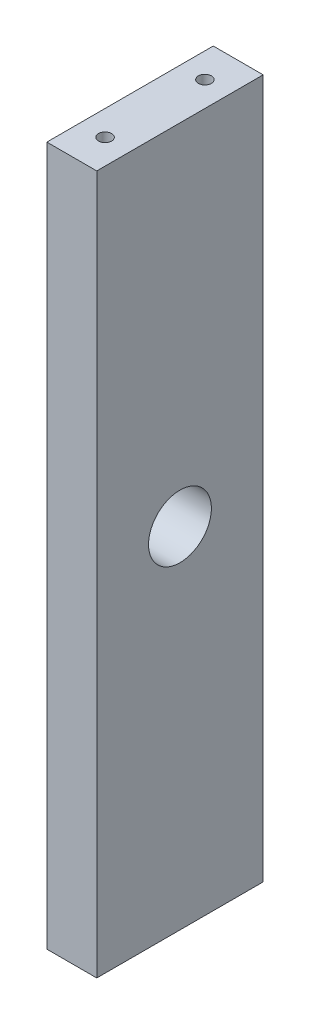
ISO-10303-21;
HEADER;
FILE_DESCRIPTION(('STEP AP214'),'2;1');
FILE_NAME('part.step','',(''),(''),'','','');
FILE_SCHEMA(('AUTOMOTIVE_DESIGN { 1 0 10303 214 1 1 1 1 }'));
ENDSEC;
DATA;
#1=APPLICATION_CONTEXT('core data for automotive mechanical design processes');
#2=APPLICATION_PROTOCOL_DEFINITION('international standard','automotive_design',2000,#1);
#3=PRODUCT_CONTEXT('',#1,'mechanical');
#4=PRODUCT('Part','Part','',(#3));
#5=PRODUCT_RELATED_PRODUCT_CATEGORY('part','',(#4));
#6=PRODUCT_DEFINITION_FORMATION('','',#4);
#7=PRODUCT_DEFINITION_CONTEXT('part definition',#1,'design');
#8=PRODUCT_DEFINITION('design','',#6,#7);
#9=PRODUCT_DEFINITION_SHAPE('','',#8);
#10=(LENGTH_UNIT() NAMED_UNIT(*) SI_UNIT(.MILLI.,.METRE.));
#11=(NAMED_UNIT(*) PLANE_ANGLE_UNIT() SI_UNIT($,.RADIAN.));
#12=(NAMED_UNIT(*) SI_UNIT($,.STERADIAN.) SOLID_ANGLE_UNIT());
#13=UNCERTAINTY_MEASURE_WITH_UNIT(LENGTH_MEASURE(1.E-05),#10,'distance_accuracy_value','');
#14=(GEOMETRIC_REPRESENTATION_CONTEXT(3) GLOBAL_UNCERTAINTY_ASSIGNED_CONTEXT((#13)) GLOBAL_UNIT_ASSIGNED_CONTEXT((#10,
#11,#12)) REPRESENTATION_CONTEXT('',''));
#15=CARTESIAN_POINT('',(0.,0.,0.));
#16=DIRECTION('',(0.,0.,1.));
#17=DIRECTION('',(1.,0.,0.));
#18=AXIS2_PLACEMENT_3D('',#15,#16,#17);
#19=CARTESIAN_POINT('',(4.7625,-66.675,-15.875));
#20=DIRECTION('',(0.,0.,1.));
#21=DIRECTION('',(1.,0.,0.));
#22=AXIS2_PLACEMENT_3D('',#19,#20,#21);
#23=PLANE('',#22);
#24=DIRECTION('',(0.,1.,0.));
#25=VECTOR('',#24,1.);
#26=CARTESIAN_POINT('',(-4.7625,-66.675,-15.875));
#27=LINE('',#26,#25);
#28=CARTESIAN_POINT('',(-4.7625,-66.675,-15.875));
#29=VERTEX_POINT('',#28);
#30=CARTESIAN_POINT('',(-4.7625,66.675,-15.875));
#31=VERTEX_POINT('',#30);
#32=EDGE_CURVE('E141',#29,#31,#27,.T.);
#33=ORIENTED_EDGE('',*,*,#32,.T.);
#34=DIRECTION('',(-1.,0.,0.));
#35=VECTOR('',#34,1.);
#36=CARTESIAN_POINT('',(4.7625,66.675,-15.875));
#37=LINE('',#36,#35);
#38=CARTESIAN_POINT('',(4.7625,66.675,-15.875));
#39=VERTEX_POINT('',#38);
#40=EDGE_CURVE('E11',#39,#31,#37,.T.);
#41=ORIENTED_EDGE('',*,*,#40,.F.);
#42=DIRECTION('',(0.,1.,0.));
#43=VECTOR('',#42,1.);
#44=CARTESIAN_POINT('',(4.7625,-66.675,-15.875));
#45=LINE('',#44,#43);
#46=CARTESIAN_POINT('',(4.7625,-66.675,-15.875));
#47=VERTEX_POINT('',#46);
#48=EDGE_CURVE('E142',#47,#39,#45,.T.);
#49=ORIENTED_EDGE('',*,*,#48,.F.);
#50=DIRECTION('',(-1.,0.,0.));
#51=VECTOR('',#50,1.);
#52=CARTESIAN_POINT('',(4.7625,-66.675,-15.875));
#53=LINE('',#52,#51);
#54=EDGE_CURVE('E148',#47,#29,#53,.T.);
#55=ORIENTED_EDGE('',*,*,#54,.T.);
#56=EDGE_LOOP('',(#33,#41,#49,#55));
#57=FACE_BOUND('',#56,.T.);
#58=ADVANCED_FACE('F46',(#57),#23,.F.);
#59=CARTESIAN_POINT('',(4.7625,66.675,15.875));
#60=DIRECTION('',(0.,-1.,0.));
#61=DIRECTION('',(0.,0.,-1.));
#62=AXIS2_PLACEMENT_3D('',#59,#60,#61);
#63=PLANE('',#62);
#64=CARTESIAN_POINT('',(0.,66.675,-9.525));
#65=DIRECTION('',(0.,1.,0.));
#66=DIRECTION('',(0.,0.,1.));
#67=AXIS2_PLACEMENT_3D('',#64,#65,#66);
#68=CIRCLE('',#67,1.24999999999999);
#69=CARTESIAN_POINT('',(0.,66.675,-8.27500000000001));
#70=VERTEX_POINT('',#69);
#71=EDGE_CURVE('E129',#70,#70,#68,.T.);
#72=ORIENTED_EDGE('',*,*,#71,.F.);
#73=EDGE_LOOP('',(#72));
#74=FACE_BOUND('',#73,.T.);
#75=CARTESIAN_POINT('',(0.,66.675,9.525));
#76=DIRECTION('',(0.,1.,0.));
#77=DIRECTION('',(0.,0.,1.));
#78=AXIS2_PLACEMENT_3D('',#75,#76,#77);
#79=CIRCLE('',#78,1.24999999999999);
#80=CARTESIAN_POINT('',(0.,66.675,10.775));
#81=VERTEX_POINT('',#80);
#82=EDGE_CURVE('E135',#81,#81,#79,.T.);
#83=ORIENTED_EDGE('',*,*,#82,.F.);
#84=EDGE_LOOP('',(#83));
#85=FACE_BOUND('',#84,.T.);
#86=DIRECTION('',(0.,0.,1.));
#87=VECTOR('',#86,1.);
#88=CARTESIAN_POINT('',(-4.7625,66.675,15.875));
#89=LINE('',#88,#87);
#90=CARTESIAN_POINT('',(-4.7625,66.675,15.875));
#91=VERTEX_POINT('',#90);
#92=EDGE_CURVE('E151',#31,#91,#89,.T.);
#93=ORIENTED_EDGE('',*,*,#92,.T.);
#94=DIRECTION('',(-1.,0.,0.));
#95=VECTOR('',#94,1.);
#96=CARTESIAN_POINT('',(4.7625,66.675,15.875));
#97=LINE('',#96,#95);
#98=CARTESIAN_POINT('',(4.7625,66.675,15.875));
#99=VERTEX_POINT('',#98);
#100=EDGE_CURVE('E54',#99,#91,#97,.T.);
#101=ORIENTED_EDGE('',*,*,#100,.F.);
#102=DIRECTION('',(0.,0.,1.));
#103=VECTOR('',#102,1.);
#104=CARTESIAN_POINT('',(4.7625,66.675,15.875));
#105=LINE('',#104,#103);
#106=EDGE_CURVE('E93',#39,#99,#105,.T.);
#107=ORIENTED_EDGE('',*,*,#106,.F.);
#108=ORIENTED_EDGE('',*,*,#40,.T.);
#109=EDGE_LOOP('',(#93,#101,#107,#108));
#110=FACE_BOUND('',#109,.T.);
#111=ADVANCED_FACE('F176',(#74,#85,#110),#63,.F.);
#112=CARTESIAN_POINT('',(4.7625,-66.675,15.875));
#113=DIRECTION('',(0.,0.,-1.));
#114=DIRECTION('',(-1.,0.,0.));
#115=AXIS2_PLACEMENT_3D('',#112,#113,#114);
#116=PLANE('',#115);
#117=DIRECTION('',(0.,-1.,0.));
#118=VECTOR('',#117,1.);
#119=CARTESIAN_POINT('',(-4.7625,-66.675,15.875));
#120=LINE('',#119,#118);
#121=CARTESIAN_POINT('',(-4.7625,-66.675,15.875));
#122=VERTEX_POINT('',#121);
#123=EDGE_CURVE('E80',#91,#122,#120,.T.);
#124=ORIENTED_EDGE('',*,*,#123,.T.);
#125=DIRECTION('',(-1.,0.,0.));
#126=VECTOR('',#125,1.);
#127=CARTESIAN_POINT('',(4.7625,-66.675,15.875));
#128=LINE('',#127,#126);
#129=CARTESIAN_POINT('',(4.7625,-66.675,15.875));
#130=VERTEX_POINT('',#129);
#131=EDGE_CURVE('E156',#130,#122,#128,.T.);
#132=ORIENTED_EDGE('',*,*,#131,.F.);
#133=DIRECTION('',(0.,-1.,0.));
#134=VECTOR('',#133,1.);
#135=CARTESIAN_POINT('',(4.7625,-66.675,15.875));
#136=LINE('',#135,#134);
#137=EDGE_CURVE('E145',#99,#130,#136,.T.);
#138=ORIENTED_EDGE('',*,*,#137,.F.);
#139=ORIENTED_EDGE('',*,*,#100,.T.);
#140=EDGE_LOOP('',(#124,#132,#138,#139));
#141=FACE_BOUND('',#140,.T.);
#142=ADVANCED_FACE('F158',(#141),#116,.F.);
#143=CARTESIAN_POINT('',(4.7625,-66.675,15.875));
#144=DIRECTION('',(0.,1.,0.));
#145=DIRECTION('',(0.,0.,1.));
#146=AXIS2_PLACEMENT_3D('',#143,#144,#145);
#147=PLANE('',#146);
#148=CARTESIAN_POINT('',(0.,-66.675,-9.525));
#149=DIRECTION('',(0.,-1.,0.));
#150=DIRECTION('',(0.,0.,-1.));
#151=AXIS2_PLACEMENT_3D('',#148,#149,#150);
#152=CIRCLE('',#151,1.24999999999999);
#153=CARTESIAN_POINT('',(0.,-66.675,-10.775));
#154=VERTEX_POINT('',#153);
#155=EDGE_CURVE('E117',#154,#154,#152,.T.);
#156=ORIENTED_EDGE('',*,*,#155,.F.);
#157=EDGE_LOOP('',(#156));
#158=FACE_BOUND('',#157,.T.);
#159=CARTESIAN_POINT('',(0.,-66.675,9.525));
#160=DIRECTION('',(0.,-1.,0.));
#161=DIRECTION('',(0.,0.,-1.));
#162=AXIS2_PLACEMENT_3D('',#159,#160,#161);
#163=CIRCLE('',#162,1.24999999999999);
#164=CARTESIAN_POINT('',(0.,-66.675,8.27500000000001));
#165=VERTEX_POINT('',#164);
#166=EDGE_CURVE('E116',#165,#165,#163,.T.);
#167=ORIENTED_EDGE('',*,*,#166,.F.);
#168=EDGE_LOOP('',(#167));
#169=FACE_BOUND('',#168,.T.);
#170=DIRECTION('',(0.,0.,-1.));
#171=VECTOR('',#170,1.);
#172=CARTESIAN_POINT('',(-4.7625,-66.675,15.875));
#173=LINE('',#172,#171);
#174=EDGE_CURVE('E86',#122,#29,#173,.T.);
#175=ORIENTED_EDGE('',*,*,#174,.T.);
#176=ORIENTED_EDGE('',*,*,#54,.F.);
#177=DIRECTION('',(0.,0.,-1.));
#178=VECTOR('',#177,1.);
#179=CARTESIAN_POINT('',(4.7625,-66.675,15.875));
#180=LINE('',#179,#178);
#181=EDGE_CURVE('E62',#130,#47,#180,.T.);
#182=ORIENTED_EDGE('',*,*,#181,.F.);
#183=ORIENTED_EDGE('',*,*,#131,.T.);
#184=EDGE_LOOP('',(#175,#176,#182,#183));
#185=FACE_BOUND('',#184,.T.);
#186=ADVANCED_FACE('F165',(#158,#169,#185),#147,.F.);
#187=CARTESIAN_POINT('',(4.7625,0.,0.));
#188=DIRECTION('',(-1.,0.,0.));
#189=DIRECTION('',(0.,0.,1.));
#190=AXIS2_PLACEMENT_3D('',#187,#188,#189);
#191=PLANE('',#190);
#192=CARTESIAN_POINT('',(4.7625,0.,0.));
#193=DIRECTION('',(1.,0.,0.));
#194=DIRECTION('',(0.,0.,-1.));
#195=AXIS2_PLACEMENT_3D('',#192,#193,#194);
#196=CIRCLE('',#195,5.99999999999999);
#197=CARTESIAN_POINT('',(4.7625,0.,-5.99999999999993));
#198=VERTEX_POINT('',#197);
#199=EDGE_CURVE('E216',#198,#198,#196,.T.);
#200=ORIENTED_EDGE('',*,*,#199,.F.);
#201=EDGE_LOOP('',(#200));
#202=FACE_BOUND('',#201,.T.);
#203=ORIENTED_EDGE('',*,*,#48,.T.);
#204=ORIENTED_EDGE('',*,*,#106,.T.);
#205=ORIENTED_EDGE('',*,*,#137,.T.);
#206=ORIENTED_EDGE('',*,*,#181,.T.);
#207=EDGE_LOOP('',(#203,#204,#205,#206));
#208=FACE_BOUND('',#207,.T.);
#209=ADVANCED_FACE('F167',(#202,#208),#191,.F.);
#210=CARTESIAN_POINT('',(-4.7625,0.,0.));
#211=DIRECTION('',(-1.,0.,0.));
#212=DIRECTION('',(0.,0.,1.));
#213=AXIS2_PLACEMENT_3D('',#210,#211,#212);
#214=PLANE('',#213);
#215=CARTESIAN_POINT('',(-4.7625,0.,0.));
#216=DIRECTION('',(1.,0.,0.));
#217=DIRECTION('',(0.,0.,-1.));
#218=AXIS2_PLACEMENT_3D('',#215,#216,#217);
#219=CIRCLE('',#218,6.);
#220=CARTESIAN_POINT('',(-4.7625,0.,-5.99999999999994));
#221=VERTEX_POINT('',#220);
#222=EDGE_CURVE('E123',#221,#221,#219,.T.);
#223=ORIENTED_EDGE('',*,*,#222,.T.);
#224=EDGE_LOOP('',(#223));
#225=FACE_BOUND('',#224,.T.);
#226=ORIENTED_EDGE('',*,*,#32,.F.);
#227=ORIENTED_EDGE('',*,*,#174,.F.);
#228=ORIENTED_EDGE('',*,*,#123,.F.);
#229=ORIENTED_EDGE('',*,*,#92,.F.);
#230=EDGE_LOOP('',(#226,#227,#228,#229));
#231=FACE_BOUND('',#230,.T.);
#232=ADVANCED_FACE('F161',(#225,#231),#214,.T.);
#233=CARTESIAN_POINT('',(0.,53.975,9.525));
#234=DIRECTION('',(0.,1.,0.));
#235=DIRECTION('',(0.,0.,1.));
#236=AXIS2_PLACEMENT_3D('',#233,#234,#235);
#237=CONICAL_SURFACE('',#236,1.25,1.02974425867665);
#238=CARTESIAN_POINT('',(0.,53.2239242262155,9.525));
#239=VERTEX_POINT('',#238);
#240=VERTEX_LOOP('',#239);
#241=FACE_BOUND('',#240,.T.);
#242=CARTESIAN_POINT('',(0.,53.975,9.525));
#243=DIRECTION('',(0.,1.,0.));
#244=DIRECTION('',(0.,0.,1.));
#245=AXIS2_PLACEMENT_3D('',#242,#243,#244);
#246=CIRCLE('',#245,1.25);
#247=CARTESIAN_POINT('',(0.,53.975,10.775));
#248=VERTEX_POINT('',#247);
#249=EDGE_CURVE('E138',#248,#248,#246,.T.);
#250=ORIENTED_EDGE('',*,*,#249,.T.);
#251=EDGE_LOOP('',(#250));
#252=FACE_BOUND('',#251,.T.);
#253=ADVANCED_FACE('F195',(#241,#252),#237,.F.);
#254=CARTESIAN_POINT('',(0.,66.675,9.525));
#255=DIRECTION('',(0.,1.,0.));
#256=DIRECTION('',(0.,0.,1.));
#257=AXIS2_PLACEMENT_3D('',#254,#255,#256);
#258=CYLINDRICAL_SURFACE('',#257,1.24999999999999);
#259=ORIENTED_EDGE('',*,*,#249,.F.);
#260=EDGE_LOOP('',(#259));
#261=FACE_BOUND('',#260,.T.);
#262=ORIENTED_EDGE('',*,*,#82,.T.);
#263=EDGE_LOOP('',(#262));
#264=FACE_BOUND('',#263,.T.);
#265=ADVANCED_FACE('F192',(#261,#264),#258,.F.);
#266=CARTESIAN_POINT('',(0.,53.975,-9.525));
#267=DIRECTION('',(0.,1.,0.));
#268=DIRECTION('',(0.,0.,1.));
#269=AXIS2_PLACEMENT_3D('',#266,#267,#268);
#270=CONICAL_SURFACE('',#269,1.25,1.02974425867665);
#271=CARTESIAN_POINT('',(0.,53.2239242262155,-9.525));
#272=VERTEX_POINT('',#271);
#273=VERTEX_LOOP('',#272);
#274=FACE_BOUND('',#273,.T.);
#275=CARTESIAN_POINT('',(0.,53.975,-9.525));
#276=DIRECTION('',(0.,1.,0.));
#277=DIRECTION('',(0.,0.,1.));
#278=AXIS2_PLACEMENT_3D('',#275,#276,#277);
#279=CIRCLE('',#278,1.25);
#280=CARTESIAN_POINT('',(0.,53.975,-8.275));
#281=VERTEX_POINT('',#280);
#282=EDGE_CURVE('E132',#281,#281,#279,.T.);
#283=ORIENTED_EDGE('',*,*,#282,.T.);
#284=EDGE_LOOP('',(#283));
#285=FACE_BOUND('',#284,.T.);
#286=ADVANCED_FACE('F194',(#274,#285),#270,.F.);
#287=CARTESIAN_POINT('',(0.,66.675,-9.525));
#288=DIRECTION('',(0.,1.,0.));
#289=DIRECTION('',(0.,0.,1.));
#290=AXIS2_PLACEMENT_3D('',#287,#288,#289);
#291=CYLINDRICAL_SURFACE('',#290,1.24999999999999);
#292=ORIENTED_EDGE('',*,*,#282,.F.);
#293=EDGE_LOOP('',(#292));
#294=FACE_BOUND('',#293,.T.);
#295=ORIENTED_EDGE('',*,*,#71,.T.);
#296=EDGE_LOOP('',(#295));
#297=FACE_BOUND('',#296,.T.);
#298=ADVANCED_FACE('F202',(#294,#297),#291,.F.);
#299=CARTESIAN_POINT('',(0.,-53.975,9.525));
#300=DIRECTION('',(0.,-1.,0.));
#301=DIRECTION('',(0.,0.,-1.));
#302=AXIS2_PLACEMENT_3D('',#299,#300,#301);
#303=CONICAL_SURFACE('',#302,1.25,1.02974425867665);
#304=CARTESIAN_POINT('',(0.,-53.2239242262155,9.525));
#305=VERTEX_POINT('',#304);
#306=VERTEX_LOOP('',#305);
#307=FACE_BOUND('',#306,.T.);
#308=CARTESIAN_POINT('',(0.,-53.975,9.525));
#309=DIRECTION('',(0.,-1.,0.));
#310=DIRECTION('',(0.,0.,-1.));
#311=AXIS2_PLACEMENT_3D('',#308,#309,#310);
#312=CIRCLE('',#311,1.25);
#313=CARTESIAN_POINT('',(0.,-53.975,8.275));
#314=VERTEX_POINT('',#313);
#315=EDGE_CURVE('E120',#314,#314,#312,.T.);
#316=ORIENTED_EDGE('',*,*,#315,.T.);
#317=EDGE_LOOP('',(#316));
#318=FACE_BOUND('',#317,.T.);
#319=ADVANCED_FACE('F231',(#307,#318),#303,.F.);
#320=CARTESIAN_POINT('',(0.,-66.675,9.525));
#321=DIRECTION('',(0.,-1.,0.));
#322=DIRECTION('',(0.,0.,-1.));
#323=AXIS2_PLACEMENT_3D('',#320,#321,#322);
#324=CYLINDRICAL_SURFACE('',#323,1.24999999999999);
#325=ORIENTED_EDGE('',*,*,#315,.F.);
#326=EDGE_LOOP('',(#325));
#327=FACE_BOUND('',#326,.T.);
#328=ORIENTED_EDGE('',*,*,#166,.T.);
#329=EDGE_LOOP('',(#328));
#330=FACE_BOUND('',#329,.T.);
#331=ADVANCED_FACE('F110',(#327,#330),#324,.F.);
#332=CARTESIAN_POINT('',(0.,-53.975,-9.525));
#333=DIRECTION('',(0.,-1.,0.));
#334=DIRECTION('',(0.,0.,-1.));
#335=AXIS2_PLACEMENT_3D('',#332,#333,#334);
#336=CONICAL_SURFACE('',#335,1.25,1.02974425867665);
#337=CARTESIAN_POINT('',(0.,-53.2239242262155,-9.525));
#338=VERTEX_POINT('',#337);
#339=VERTEX_LOOP('',#338);
#340=FACE_BOUND('',#339,.T.);
#341=CARTESIAN_POINT('',(0.,-53.975,-9.525));
#342=DIRECTION('',(0.,-1.,0.));
#343=DIRECTION('',(0.,0.,-1.));
#344=AXIS2_PLACEMENT_3D('',#341,#342,#343);
#345=CIRCLE('',#344,1.25);
#346=CARTESIAN_POINT('',(0.,-53.975,-10.775));
#347=VERTEX_POINT('',#346);
#348=EDGE_CURVE('E114',#347,#347,#345,.T.);
#349=ORIENTED_EDGE('',*,*,#348,.T.);
#350=EDGE_LOOP('',(#349));
#351=FACE_BOUND('',#350,.T.);
#352=ADVANCED_FACE('F106',(#340,#351),#336,.F.);
#353=CARTESIAN_POINT('',(0.,-66.675,-9.525));
#354=DIRECTION('',(0.,-1.,0.));
#355=DIRECTION('',(0.,0.,-1.));
#356=AXIS2_PLACEMENT_3D('',#353,#354,#355);
#357=CYLINDRICAL_SURFACE('',#356,1.24999999999999);
#358=ORIENTED_EDGE('',*,*,#348,.F.);
#359=EDGE_LOOP('',(#358));
#360=FACE_BOUND('',#359,.T.);
#361=ORIENTED_EDGE('',*,*,#155,.T.);
#362=EDGE_LOOP('',(#361));
#363=FACE_BOUND('',#362,.T.);
#364=ADVANCED_FACE('F109',(#360,#363),#357,.F.);
#365=CARTESIAN_POINT('',(4.7625,0.,0.));
#366=DIRECTION('',(1.,0.,0.));
#367=DIRECTION('',(0.,0.,-1.));
#368=AXIS2_PLACEMENT_3D('',#365,#366,#367);
#369=CYLINDRICAL_SURFACE('',#368,5.99999999999999);
#370=ORIENTED_EDGE('',*,*,#222,.F.);
#371=EDGE_LOOP('',(#370));
#372=FACE_BOUND('',#371,.T.);
#373=ORIENTED_EDGE('',*,*,#199,.T.);
#374=EDGE_LOOP('',(#373));
#375=FACE_BOUND('',#374,.T.);
#376=ADVANCED_FACE('F221',(#372,#375),#369,.F.);
#377=CLOSED_SHELL('',(#58,#111,#142,#186,#209,#232,#253,#265,#286,#298,#319,#331,#352,#364,#376));
#378=MANIFOLD_SOLID_BREP('B2',#377);
#379=ADVANCED_BREP_SHAPE_REPRESENTATION('',(#18,#378),#14);
#380=SHAPE_DEFINITION_REPRESENTATION(#9,#379);
ENDSEC;
END-ISO-10303-21;
